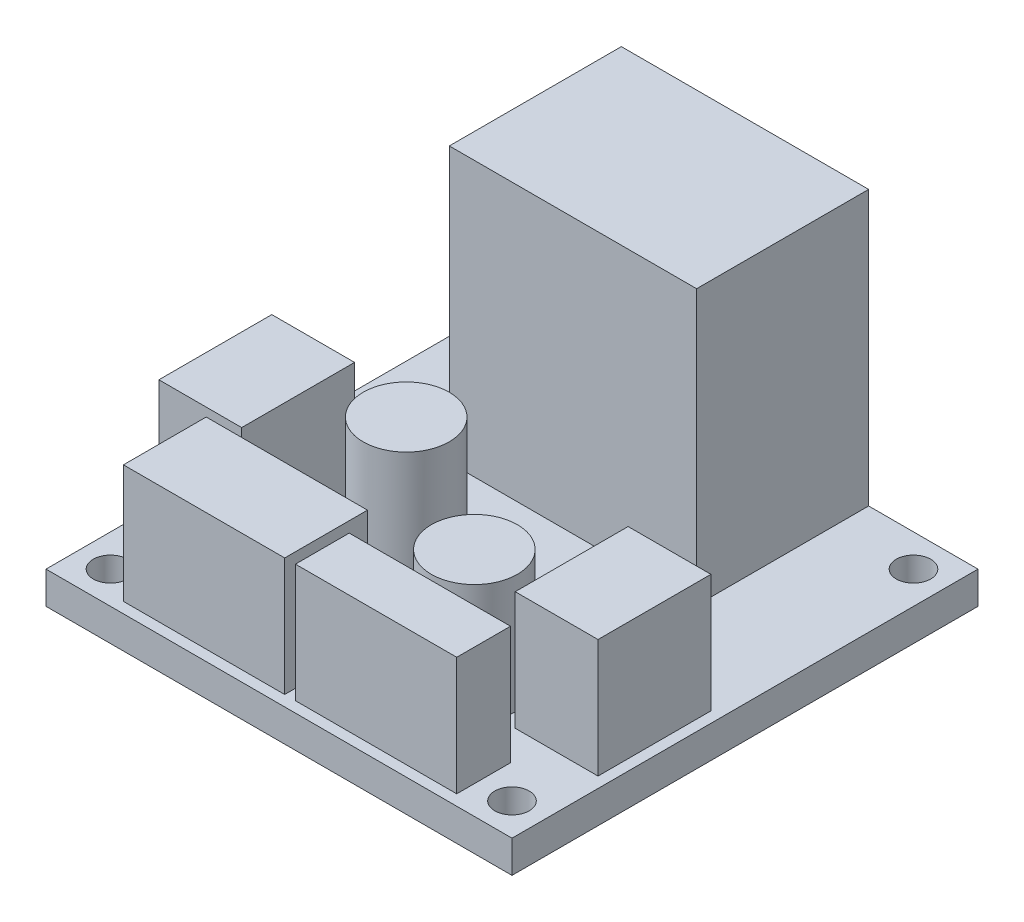
ISO-10303-21;
HEADER;
FILE_DESCRIPTION(('STEP AP214'),'2;1');
FILE_NAME('part.step','',(''),(''),'','','');
FILE_SCHEMA(('AUTOMOTIVE_DESIGN { 1 0 10303 214 1 1 1 1 }'));
ENDSEC;
DATA;
#1=APPLICATION_CONTEXT('core data for automotive mechanical design processes');
#2=APPLICATION_PROTOCOL_DEFINITION('international standard','automotive_design',2000,#1);
#3=PRODUCT_CONTEXT('',#1,'mechanical');
#4=PRODUCT('Part','Part','',(#3));
#5=PRODUCT_RELATED_PRODUCT_CATEGORY('part','',(#4));
#6=PRODUCT_DEFINITION_FORMATION('','',#4);
#7=PRODUCT_DEFINITION_CONTEXT('part definition',#1,'design');
#8=PRODUCT_DEFINITION('design','',#6,#7);
#9=PRODUCT_DEFINITION_SHAPE('','',#8);
#10=(LENGTH_UNIT() NAMED_UNIT(*) SI_UNIT(.MILLI.,.METRE.));
#11=(NAMED_UNIT(*) PLANE_ANGLE_UNIT() SI_UNIT($,.RADIAN.));
#12=(NAMED_UNIT(*) SI_UNIT($,.STERADIAN.) SOLID_ANGLE_UNIT());
#13=UNCERTAINTY_MEASURE_WITH_UNIT(LENGTH_MEASURE(1.E-05),#10,'distance_accuracy_value','');
#14=(GEOMETRIC_REPRESENTATION_CONTEXT(3) GLOBAL_UNCERTAINTY_ASSIGNED_CONTEXT((#13)) GLOBAL_UNIT_ASSIGNED_CONTEXT((#10,
#11,#12)) REPRESENTATION_CONTEXT('',''));
#15=CARTESIAN_POINT('',(0.,0.,0.));
#16=DIRECTION('',(0.,0.,1.));
#17=DIRECTION('',(1.,0.,0.));
#18=AXIS2_PLACEMENT_3D('',#15,#16,#17);
#19=CARTESIAN_POINT('',(0.,3.,0.));
#20=DIRECTION('',(0.,-1.,0.));
#21=DIRECTION('',(0.,0.,-1.));
#22=AXIS2_PLACEMENT_3D('',#19,#20,#21);
#23=PLANE('',#22);
#24=CARTESIAN_POINT('',(-18.67,3.,18.67));
#25=DIRECTION('',(0.,1.,0.));
#26=DIRECTION('',(0.,0.,1.));
#27=AXIS2_PLACEMENT_3D('',#24,#25,#26);
#28=CIRCLE('',#27,1.6);
#29=CARTESIAN_POINT('',(-18.67,3.,20.27));
#30=VERTEX_POINT('',#29);
#31=EDGE_CURVE('E422',#30,#30,#28,.T.);
#32=ORIENTED_EDGE('',*,*,#31,.F.);
#33=EDGE_LOOP('',(#32));
#34=FACE_BOUND('',#33,.T.);
#35=CARTESIAN_POINT('',(18.67,3.,18.67));
#36=DIRECTION('',(0.,1.,0.));
#37=DIRECTION('',(0.,0.,1.));
#38=AXIS2_PLACEMENT_3D('',#35,#36,#37);
#39=CIRCLE('',#38,1.6);
#40=CARTESIAN_POINT('',(18.67,3.,20.27));
#41=VERTEX_POINT('',#40);
#42=EDGE_CURVE('E428',#41,#41,#39,.T.);
#43=ORIENTED_EDGE('',*,*,#42,.F.);
#44=EDGE_LOOP('',(#43));
#45=FACE_BOUND('',#44,.T.);
#46=CARTESIAN_POINT('',(18.67,3.,-18.67));
#47=DIRECTION('',(0.,1.,0.));
#48=DIRECTION('',(0.,0.,1.));
#49=AXIS2_PLACEMENT_3D('',#46,#47,#48);
#50=CIRCLE('',#49,1.6);
#51=CARTESIAN_POINT('',(18.67,3.,-17.07));
#52=VERTEX_POINT('',#51);
#53=EDGE_CURVE('E434',#52,#52,#50,.T.);
#54=ORIENTED_EDGE('',*,*,#53,.F.);
#55=EDGE_LOOP('',(#54));
#56=FACE_BOUND('',#55,.T.);
#57=CARTESIAN_POINT('',(-18.67,3.,-18.67));
#58=DIRECTION('',(0.,1.,0.));
#59=DIRECTION('',(0.,0.,1.));
#60=AXIS2_PLACEMENT_3D('',#57,#58,#59);
#61=CIRCLE('',#60,1.6);
#62=CARTESIAN_POINT('',(-18.67,3.,-17.07));
#63=VERTEX_POINT('',#62);
#64=EDGE_CURVE('E416',#63,#63,#61,.T.);
#65=ORIENTED_EDGE('',*,*,#64,.F.);
#66=EDGE_LOOP('',(#65));
#67=FACE_BOUND('',#66,.T.);
#68=CARTESIAN_POINT('',(7.67,3.,11.17));
#69=DIRECTION('',(0.,-1.,0.));
#70=DIRECTION('',(0.,0.,-1.));
#71=AXIS2_PLACEMENT_3D('',#68,#69,#70);
#72=CIRCLE('',#71,4.);
#73=CARTESIAN_POINT('',(7.67,3.,7.17));
#74=VERTEX_POINT('',#73);
#75=EDGE_CURVE('E12',#74,#74,#72,.F.);
#76=ORIENTED_EDGE('',*,*,#75,.F.);
#77=EDGE_LOOP('',(#76));
#78=FACE_BOUND('',#77,.T.);
#79=CARTESIAN_POINT('',(-6.17,3.,3.67));
#80=DIRECTION('',(0.,-1.,0.));
#81=DIRECTION('',(0.,0.,-1.));
#82=AXIS2_PLACEMENT_3D('',#79,#80,#81);
#83=CIRCLE('',#82,4.);
#84=CARTESIAN_POINT('',(-6.17,3.,-0.329999999999998));
#85=VERTEX_POINT('',#84);
#86=EDGE_CURVE('E44',#85,#85,#83,.F.);
#87=ORIENTED_EDGE('',*,*,#86,.F.);
#88=EDGE_LOOP('',(#87));
#89=FACE_BOUND('',#88,.T.);
#90=DIRECTION('',(0.,0.,1.));
#91=VECTOR('',#90,1.);
#92=CARTESIAN_POINT('',(0.529999999999997,3.,15.67));
#93=LINE('',#92,#91);
#94=CARTESIAN_POINT('',(0.529999999999997,3.,15.67));
#95=VERTEX_POINT('',#94);
#96=CARTESIAN_POINT('',(0.529999999999998,3.,20.67));
#97=VERTEX_POINT('',#96);
#98=EDGE_CURVE('E218',#95,#97,#93,.T.);
#99=ORIENTED_EDGE('',*,*,#98,.F.);
#100=DIRECTION('',(-1.,0.,0.));
#101=VECTOR('',#100,1.);
#102=CARTESIAN_POINT('',(0.529999999999997,3.,15.67));
#103=LINE('',#102,#101);
#104=CARTESIAN_POINT('',(15.53,3.,15.67));
#105=VERTEX_POINT('',#104);
#106=EDGE_CURVE('E231',#105,#95,#103,.T.);
#107=ORIENTED_EDGE('',*,*,#106,.F.);
#108=DIRECTION('',(0.,0.,-1.));
#109=VECTOR('',#108,1.);
#110=CARTESIAN_POINT('',(15.53,3.,15.67));
#111=LINE('',#110,#109);
#112=CARTESIAN_POINT('',(15.53,3.,20.67));
#113=VERTEX_POINT('',#112);
#114=EDGE_CURVE('E240',#113,#105,#111,.T.);
#115=ORIENTED_EDGE('',*,*,#114,.F.);
#116=DIRECTION('',(1.,0.,0.));
#117=VECTOR('',#116,1.);
#118=CARTESIAN_POINT('',(0.529999999999998,3.,20.67));
#119=LINE('',#118,#117);
#120=EDGE_CURVE('E221',#97,#113,#119,.T.);
#121=ORIENTED_EDGE('',*,*,#120,.F.);
#122=EDGE_LOOP('',(#99,#107,#115,#121));
#123=FACE_BOUND('',#122,.T.);
#124=DIRECTION('',(0.,0.,1.));
#125=VECTOR('',#124,1.);
#126=CARTESIAN_POINT('',(-20.67,3.,1.67));
#127=LINE('',#126,#125);
#128=CARTESIAN_POINT('',(-20.67,3.,1.67));
#129=VERTEX_POINT('',#128);
#130=CARTESIAN_POINT('',(-20.67,3.,12.17));
#131=VERTEX_POINT('',#130);
#132=EDGE_CURVE('E289',#129,#131,#127,.T.);
#133=ORIENTED_EDGE('',*,*,#132,.F.);
#134=DIRECTION('',(-1.,0.,0.));
#135=VECTOR('',#134,1.);
#136=CARTESIAN_POINT('',(-20.67,3.,1.67));
#137=LINE('',#136,#135);
#138=CARTESIAN_POINT('',(-12.97,3.,1.67));
#139=VERTEX_POINT('',#138);
#140=EDGE_CURVE('E294',#139,#129,#137,.T.);
#141=ORIENTED_EDGE('',*,*,#140,.F.);
#142=DIRECTION('',(0.,0.,-1.));
#143=VECTOR('',#142,1.);
#144=CARTESIAN_POINT('',(-12.97,3.,1.67));
#145=LINE('',#144,#143);
#146=CARTESIAN_POINT('',(-12.97,3.,12.17));
#147=VERTEX_POINT('',#146);
#148=EDGE_CURVE('E306',#147,#139,#145,.T.);
#149=ORIENTED_EDGE('',*,*,#148,.F.);
#150=DIRECTION('',(1.,0.,0.));
#151=VECTOR('',#150,1.);
#152=CARTESIAN_POINT('',(-20.67,3.,12.17));
#153=LINE('',#152,#151);
#154=EDGE_CURVE('E303',#131,#147,#153,.T.);
#155=ORIENTED_EDGE('',*,*,#154,.F.);
#156=EDGE_LOOP('',(#133,#141,#149,#155));
#157=FACE_BOUND('',#156,.T.);
#158=DIRECTION('',(1.,0.,0.));
#159=VECTOR('',#158,1.);
#160=CARTESIAN_POINT('',(-21.67,3.,21.67));
#161=LINE('',#160,#159);
#162=CARTESIAN_POINT('',(-21.67,3.,21.67));
#163=VERTEX_POINT('',#162);
#164=CARTESIAN_POINT('',(21.67,3.,21.67));
#165=VERTEX_POINT('',#164);
#166=EDGE_CURVE('E332',#163,#165,#161,.T.);
#167=ORIENTED_EDGE('',*,*,#166,.T.);
#168=DIRECTION('',(0.,0.,-1.));
#169=VECTOR('',#168,1.);
#170=CARTESIAN_POINT('',(21.67,3.,21.67));
#171=LINE('',#170,#169);
#172=CARTESIAN_POINT('',(21.67,3.,-21.67));
#173=VERTEX_POINT('',#172);
#174=EDGE_CURVE('E325',#165,#173,#171,.T.);
#175=ORIENTED_EDGE('',*,*,#174,.T.);
#176=DIRECTION('',(-1.,0.,0.));
#177=VECTOR('',#176,1.);
#178=CARTESIAN_POINT('',(21.67,3.,-21.67));
#179=LINE('',#178,#177);
#180=CARTESIAN_POINT('',(11.5,3.,-21.67));
#181=VERTEX_POINT('',#180);
#182=EDGE_CURVE('E331',#173,#181,#179,.T.);
#183=ORIENTED_EDGE('',*,*,#182,.T.);
#184=DIRECTION('',(0.,0.,1.));
#185=VECTOR('',#184,1.);
#186=CARTESIAN_POINT('',(11.5,3.,-21.67));
#187=LINE('',#186,#185);
#188=CARTESIAN_POINT('',(11.5,3.,-5.67));
#189=VERTEX_POINT('',#188);
#190=EDGE_CURVE('E348',#181,#189,#187,.T.);
#191=ORIENTED_EDGE('',*,*,#190,.T.);
#192=DIRECTION('',(-1.,0.,0.));
#193=VECTOR('',#192,1.);
#194=CARTESIAN_POINT('',(-11.5,3.,-5.67));
#195=LINE('',#194,#193);
#196=CARTESIAN_POINT('',(-11.5,3.,-5.67));
#197=VERTEX_POINT('',#196);
#198=EDGE_CURVE('E344',#189,#197,#195,.T.);
#199=ORIENTED_EDGE('',*,*,#198,.T.);
#200=DIRECTION('',(0.,0.,-1.));
#201=VECTOR('',#200,1.);
#202=CARTESIAN_POINT('',(-11.5,3.,-21.67));
#203=LINE('',#202,#201);
#204=CARTESIAN_POINT('',(-11.5,3.,-21.67));
#205=VERTEX_POINT('',#204);
#206=EDGE_CURVE('E340',#197,#205,#203,.T.);
#207=ORIENTED_EDGE('',*,*,#206,.T.);
#208=DIRECTION('',(-1.,0.,0.));
#209=VECTOR('',#208,1.);
#210=CARTESIAN_POINT('',(-11.5,3.,-21.67));
#211=LINE('',#210,#209);
#212=CARTESIAN_POINT('',(-21.67,3.,-21.67));
#213=VERTEX_POINT('',#212);
#214=EDGE_CURVE('E337',#205,#213,#211,.T.);
#215=ORIENTED_EDGE('',*,*,#214,.T.);
#216=DIRECTION('',(0.,0.,1.));
#217=VECTOR('',#216,1.);
#218=CARTESIAN_POINT('',(-21.67,3.,-21.67));
#219=LINE('',#218,#217);
#220=EDGE_CURVE('E335',#213,#163,#219,.T.);
#221=ORIENTED_EDGE('',*,*,#220,.T.);
#222=EDGE_LOOP('',(#167,#175,#183,#191,#199,#207,#215,#221));
#223=FACE_BOUND('',#222,.T.);
#224=DIRECTION('',(0.,0.,1.));
#225=VECTOR('',#224,1.);
#226=CARTESIAN_POINT('',(-15.47,3.,12.97));
#227=LINE('',#226,#225);
#228=CARTESIAN_POINT('',(-15.47,3.,12.97));
#229=VERTEX_POINT('',#228);
#230=CARTESIAN_POINT('',(-15.47,3.,20.67));
#231=VERTEX_POINT('',#230);
#232=EDGE_CURVE('E256',#229,#231,#227,.T.);
#233=ORIENTED_EDGE('',*,*,#232,.F.);
#234=DIRECTION('',(-1.,0.,0.));
#235=VECTOR('',#234,1.);
#236=CARTESIAN_POINT('',(-15.47,3.,12.97));
#237=LINE('',#236,#235);
#238=CARTESIAN_POINT('',(-0.470000000000003,3.,12.97));
#239=VERTEX_POINT('',#238);
#240=EDGE_CURVE('E261',#239,#229,#237,.T.);
#241=ORIENTED_EDGE('',*,*,#240,.F.);
#242=DIRECTION('',(0.,0.,-1.));
#243=VECTOR('',#242,1.);
#244=CARTESIAN_POINT('',(-0.470000000000003,3.,12.97));
#245=LINE('',#244,#243);
#246=CARTESIAN_POINT('',(-0.470000000000003,3.,20.67));
#247=VERTEX_POINT('',#246);
#248=EDGE_CURVE('E273',#247,#239,#245,.T.);
#249=ORIENTED_EDGE('',*,*,#248,.F.);
#250=DIRECTION('',(1.,0.,0.));
#251=VECTOR('',#250,1.);
#252=CARTESIAN_POINT('',(-15.47,3.,20.67));
#253=LINE('',#252,#251);
#254=EDGE_CURVE('E270',#231,#247,#253,.T.);
#255=ORIENTED_EDGE('',*,*,#254,.F.);
#256=EDGE_LOOP('',(#233,#241,#249,#255));
#257=FACE_BOUND('',#256,.T.);
#258=DIRECTION('',(0.,0.,1.));
#259=VECTOR('',#258,1.);
#260=CARTESIAN_POINT('',(12.97,3.,2.17));
#261=LINE('',#260,#259);
#262=CARTESIAN_POINT('',(12.97,3.,2.17));
#263=VERTEX_POINT('',#262);
#264=CARTESIAN_POINT('',(12.97,3.,12.67));
#265=VERTEX_POINT('',#264);
#266=EDGE_CURVE('E217',#263,#265,#261,.T.);
#267=ORIENTED_EDGE('',*,*,#266,.F.);
#268=DIRECTION('',(-1.,0.,0.));
#269=VECTOR('',#268,1.);
#270=CARTESIAN_POINT('',(12.97,3.,2.17));
#271=LINE('',#270,#269);
#272=CARTESIAN_POINT('',(20.67,3.,2.17));
#273=VERTEX_POINT('',#272);
#274=EDGE_CURVE('E214',#273,#263,#271,.T.);
#275=ORIENTED_EDGE('',*,*,#274,.F.);
#276=DIRECTION('',(0.,0.,-1.));
#277=VECTOR('',#276,1.);
#278=CARTESIAN_POINT('',(20.67,3.,2.17));
#279=LINE('',#278,#277);
#280=CARTESIAN_POINT('',(20.67,3.,12.67));
#281=VERTEX_POINT('',#280);
#282=EDGE_CURVE('E56',#281,#273,#279,.T.);
#283=ORIENTED_EDGE('',*,*,#282,.F.);
#284=DIRECTION('',(1.,0.,0.));
#285=VECTOR('',#284,1.);
#286=CARTESIAN_POINT('',(12.97,3.,12.67));
#287=LINE('',#286,#285);
#288=EDGE_CURVE('E51',#265,#281,#287,.T.);
#289=ORIENTED_EDGE('',*,*,#288,.F.);
#290=EDGE_LOOP('',(#267,#275,#283,#289));
#291=FACE_BOUND('',#290,.T.);
#292=ADVANCED_FACE('F36',(#34,#45,#56,#67,#78,#89,#123,#157,#223,#257,#291),#23,.F.);
#293=CARTESIAN_POINT('',(21.67,28.5,21.67));
#294=DIRECTION('',(-1.,0.,0.));
#295=DIRECTION('',(0.,0.,1.));
#296=AXIS2_PLACEMENT_3D('',#293,#294,#295);
#297=PLANE('',#296);
#298=DIRECTION('',(0.,-1.,0.));
#299=VECTOR('',#298,1.);
#300=CARTESIAN_POINT('',(21.67,28.5,-21.67));
#301=LINE('',#300,#299);
#302=CARTESIAN_POINT('',(21.67,0.,-21.67));
#303=VERTEX_POINT('',#302);
#304=EDGE_CURVE('E380',#173,#303,#301,.T.);
#305=ORIENTED_EDGE('',*,*,#304,.F.);
#306=ORIENTED_EDGE('',*,*,#174,.F.);
#307=DIRECTION('',(0.,-1.,0.));
#308=VECTOR('',#307,1.);
#309=CARTESIAN_POINT('',(21.67,28.5,21.67));
#310=LINE('',#309,#308);
#311=CARTESIAN_POINT('',(21.67,0.,21.67));
#312=VERTEX_POINT('',#311);
#313=EDGE_CURVE('E363',#165,#312,#310,.T.);
#314=ORIENTED_EDGE('',*,*,#313,.T.);
#315=DIRECTION('',(0.,0.,-1.));
#316=VECTOR('',#315,1.);
#317=CARTESIAN_POINT('',(21.67,0.,21.67));
#318=LINE('',#317,#316);
#319=EDGE_CURVE('E334',#312,#303,#318,.T.);
#320=ORIENTED_EDGE('',*,*,#319,.T.);
#321=EDGE_LOOP('',(#305,#306,#314,#320));
#322=FACE_BOUND('',#321,.T.);
#323=ADVANCED_FACE('F38',(#322),#297,.F.);
#324=CARTESIAN_POINT('',(-21.67,28.5,-21.67));
#325=DIRECTION('',(0.,0.,1.));
#326=DIRECTION('',(1.,0.,0.));
#327=AXIS2_PLACEMENT_3D('',#324,#325,#326);
#328=PLANE('',#327);
#329=DIRECTION('',(0.,1.,0.));
#330=VECTOR('',#329,1.);
#331=CARTESIAN_POINT('',(11.5,-61.2920157932499,-21.67));
#332=LINE('',#331,#330);
#333=CARTESIAN_POINT('',(11.5,28.5,-21.67));
#334=VERTEX_POINT('',#333);
#335=EDGE_CURVE('E351',#181,#334,#332,.T.);
#336=ORIENTED_EDGE('',*,*,#335,.F.);
#337=ORIENTED_EDGE('',*,*,#182,.F.);
#338=ORIENTED_EDGE('',*,*,#304,.T.);
#339=DIRECTION('',(-1.,0.,0.));
#340=VECTOR('',#339,1.);
#341=CARTESIAN_POINT('',(-21.67,0.,-21.67));
#342=LINE('',#341,#340);
#343=CARTESIAN_POINT('',(-21.67,0.,-21.67));
#344=VERTEX_POINT('',#343);
#345=EDGE_CURVE('E367',#303,#344,#342,.T.);
#346=ORIENTED_EDGE('',*,*,#345,.T.);
#347=DIRECTION('',(0.,-1.,0.));
#348=VECTOR('',#347,1.);
#349=CARTESIAN_POINT('',(-21.67,28.5,-21.67));
#350=LINE('',#349,#348);
#351=EDGE_CURVE('E378',#213,#344,#350,.T.);
#352=ORIENTED_EDGE('',*,*,#351,.F.);
#353=ORIENTED_EDGE('',*,*,#214,.F.);
#354=DIRECTION('',(0.,1.,0.));
#355=VECTOR('',#354,1.);
#356=CARTESIAN_POINT('',(-11.5,-61.2920157932499,-21.67));
#357=LINE('',#356,#355);
#358=CARTESIAN_POINT('',(-11.5,28.5,-21.67));
#359=VERTEX_POINT('',#358);
#360=EDGE_CURVE('E339',#205,#359,#357,.T.);
#361=ORIENTED_EDGE('',*,*,#360,.T.);
#362=DIRECTION('',(-1.,0.,0.));
#363=VECTOR('',#362,1.);
#364=CARTESIAN_POINT('',(-21.67,28.5,-21.67));
#365=LINE('',#364,#363);
#366=EDGE_CURVE('E360',#334,#359,#365,.T.);
#367=ORIENTED_EDGE('',*,*,#366,.F.);
#368=EDGE_LOOP('',(#336,#337,#338,#346,#352,#353,#361,#367));
#369=FACE_BOUND('',#368,.T.);
#370=ADVANCED_FACE('F573',(#369),#328,.F.);
#371=CARTESIAN_POINT('',(-21.67,28.5,21.67));
#372=DIRECTION('',(1.,0.,0.));
#373=DIRECTION('',(0.,0.,-1.));
#374=AXIS2_PLACEMENT_3D('',#371,#372,#373);
#375=PLANE('',#374);
#376=DIRECTION('',(0.,-1.,0.));
#377=VECTOR('',#376,1.);
#378=CARTESIAN_POINT('',(-21.67,28.5,21.67));
#379=LINE('',#378,#377);
#380=CARTESIAN_POINT('',(-21.67,0.,21.67));
#381=VERTEX_POINT('',#380);
#382=EDGE_CURVE('E376',#163,#381,#379,.T.);
#383=ORIENTED_EDGE('',*,*,#382,.F.);
#384=ORIENTED_EDGE('',*,*,#220,.F.);
#385=ORIENTED_EDGE('',*,*,#351,.T.);
#386=DIRECTION('',(0.,0.,1.));
#387=VECTOR('',#386,1.);
#388=CARTESIAN_POINT('',(-21.67,0.,21.67));
#389=LINE('',#388,#387);
#390=EDGE_CURVE('E370',#344,#381,#389,.T.);
#391=ORIENTED_EDGE('',*,*,#390,.T.);
#392=EDGE_LOOP('',(#383,#384,#385,#391));
#393=FACE_BOUND('',#392,.T.);
#394=ADVANCED_FACE('F570',(#393),#375,.F.);
#395=CARTESIAN_POINT('',(-21.67,28.5,21.67));
#396=DIRECTION('',(0.,0.,-1.));
#397=DIRECTION('',(-1.,0.,0.));
#398=AXIS2_PLACEMENT_3D('',#395,#396,#397);
#399=PLANE('',#398);
#400=ORIENTED_EDGE('',*,*,#313,.F.);
#401=ORIENTED_EDGE('',*,*,#166,.F.);
#402=ORIENTED_EDGE('',*,*,#382,.T.);
#403=DIRECTION('',(1.,0.,0.));
#404=VECTOR('',#403,1.);
#405=CARTESIAN_POINT('',(-21.67,0.,21.67));
#406=LINE('',#405,#404);
#407=EDGE_CURVE('E364',#381,#312,#406,.T.);
#408=ORIENTED_EDGE('',*,*,#407,.T.);
#409=EDGE_LOOP('',(#400,#401,#402,#408));
#410=FACE_BOUND('',#409,.T.);
#411=ADVANCED_FACE('F563',(#410),#399,.F.);
#412=CARTESIAN_POINT('',(0.,28.5,0.));
#413=DIRECTION('',(0.,-1.,0.));
#414=DIRECTION('',(0.,0.,-1.));
#415=AXIS2_PLACEMENT_3D('',#412,#413,#414);
#416=PLANE('',#415);
#417=DIRECTION('',(-1.,0.,0.));
#418=VECTOR('',#417,1.);
#419=CARTESIAN_POINT('',(-11.5,28.5,-5.67));
#420=LINE('',#419,#418);
#421=CARTESIAN_POINT('',(11.5,28.5,-5.67));
#422=VERTEX_POINT('',#421);
#423=CARTESIAN_POINT('',(-11.5,28.5,-5.67));
#424=VERTEX_POINT('',#423);
#425=EDGE_CURVE('E326',#422,#424,#420,.T.);
#426=ORIENTED_EDGE('',*,*,#425,.F.);
#427=DIRECTION('',(0.,0.,1.));
#428=VECTOR('',#427,1.);
#429=CARTESIAN_POINT('',(11.5,28.5,-21.67));
#430=LINE('',#429,#428);
#431=EDGE_CURVE('E322',#334,#422,#430,.T.);
#432=ORIENTED_EDGE('',*,*,#431,.F.);
#433=ORIENTED_EDGE('',*,*,#366,.T.);
#434=DIRECTION('',(0.,0.,-1.));
#435=VECTOR('',#434,1.);
#436=CARTESIAN_POINT('',(-11.5,28.5,-21.67));
#437=LINE('',#436,#435);
#438=EDGE_CURVE('E323',#424,#359,#437,.T.);
#439=ORIENTED_EDGE('',*,*,#438,.F.);
#440=EDGE_LOOP('',(#426,#432,#433,#439));
#441=FACE_BOUND('',#440,.T.);
#442=ADVANCED_FACE('F560',(#441),#416,.F.);
#443=CARTESIAN_POINT('',(0.,0.,0.));
#444=DIRECTION('',(0.,-1.,0.));
#445=DIRECTION('',(0.,0.,-1.));
#446=AXIS2_PLACEMENT_3D('',#443,#444,#445);
#447=PLANE('',#446);
#448=CARTESIAN_POINT('',(-18.67,0.,18.67));
#449=DIRECTION('',(0.,1.,0.));
#450=DIRECTION('',(0.,0.,1.));
#451=AXIS2_PLACEMENT_3D('',#448,#449,#450);
#452=CIRCLE('',#451,1.6);
#453=CARTESIAN_POINT('',(-18.67,0.,20.27));
#454=VERTEX_POINT('',#453);
#455=EDGE_CURVE('E425',#454,#454,#452,.T.);
#456=ORIENTED_EDGE('',*,*,#455,.T.);
#457=EDGE_LOOP('',(#456));
#458=FACE_BOUND('',#457,.T.);
#459=CARTESIAN_POINT('',(18.67,0.,18.67));
#460=DIRECTION('',(0.,1.,0.));
#461=DIRECTION('',(0.,0.,1.));
#462=AXIS2_PLACEMENT_3D('',#459,#460,#461);
#463=CIRCLE('',#462,1.6);
#464=CARTESIAN_POINT('',(18.67,0.,20.27));
#465=VERTEX_POINT('',#464);
#466=EDGE_CURVE('E431',#465,#465,#463,.T.);
#467=ORIENTED_EDGE('',*,*,#466,.T.);
#468=EDGE_LOOP('',(#467));
#469=FACE_BOUND('',#468,.T.);
#470=CARTESIAN_POINT('',(18.67,0.,-18.67));
#471=DIRECTION('',(0.,1.,0.));
#472=DIRECTION('',(0.,0.,1.));
#473=AXIS2_PLACEMENT_3D('',#470,#471,#472);
#474=CIRCLE('',#473,1.6);
#475=CARTESIAN_POINT('',(18.67,0.,-17.07));
#476=VERTEX_POINT('',#475);
#477=EDGE_CURVE('E419',#476,#476,#474,.T.);
#478=ORIENTED_EDGE('',*,*,#477,.T.);
#479=EDGE_LOOP('',(#478));
#480=FACE_BOUND('',#479,.T.);
#481=CARTESIAN_POINT('',(-18.67,0.,-18.67));
#482=DIRECTION('',(0.,1.,0.));
#483=DIRECTION('',(0.,0.,1.));
#484=AXIS2_PLACEMENT_3D('',#481,#482,#483);
#485=CIRCLE('',#484,1.6);
#486=CARTESIAN_POINT('',(-18.67,0.,-17.07));
#487=VERTEX_POINT('',#486);
#488=EDGE_CURVE('E415',#487,#487,#485,.T.);
#489=ORIENTED_EDGE('',*,*,#488,.T.);
#490=EDGE_LOOP('',(#489));
#491=FACE_BOUND('',#490,.T.);
#492=ORIENTED_EDGE('',*,*,#319,.F.);
#493=ORIENTED_EDGE('',*,*,#407,.F.);
#494=ORIENTED_EDGE('',*,*,#390,.F.);
#495=ORIENTED_EDGE('',*,*,#345,.F.);
#496=EDGE_LOOP('',(#492,#493,#494,#495));
#497=FACE_BOUND('',#496,.T.);
#498=ADVANCED_FACE('F440',(#458,#469,#480,#491,#497),#447,.T.);
#499=CARTESIAN_POINT('',(11.5,-61.2920157932499,-21.67));
#500=DIRECTION('',(-1.,0.,0.));
#501=DIRECTION('',(0.,0.,1.));
#502=AXIS2_PLACEMENT_3D('',#499,#500,#501);
#503=PLANE('',#502);
#504=ORIENTED_EDGE('',*,*,#335,.T.);
#505=ORIENTED_EDGE('',*,*,#431,.T.);
#506=DIRECTION('',(0.,1.,0.));
#507=VECTOR('',#506,1.);
#508=CARTESIAN_POINT('',(11.5,-61.2920157932499,-5.67));
#509=LINE('',#508,#507);
#510=EDGE_CURVE('E347',#189,#422,#509,.T.);
#511=ORIENTED_EDGE('',*,*,#510,.F.);
#512=ORIENTED_EDGE('',*,*,#190,.F.);
#513=EDGE_LOOP('',(#504,#505,#511,#512));
#514=FACE_BOUND('',#513,.T.);
#515=ADVANCED_FACE('F555',(#514),#503,.F.);
#516=CARTESIAN_POINT('',(-11.5,-61.2920157932499,-5.67));
#517=DIRECTION('',(0.,0.,-1.));
#518=DIRECTION('',(-1.,0.,0.));
#519=AXIS2_PLACEMENT_3D('',#516,#517,#518);
#520=PLANE('',#519);
#521=ORIENTED_EDGE('',*,*,#510,.T.);
#522=ORIENTED_EDGE('',*,*,#425,.T.);
#523=DIRECTION('',(0.,1.,0.));
#524=VECTOR('',#523,1.);
#525=CARTESIAN_POINT('',(-11.5,-61.2920157932499,-5.67));
#526=LINE('',#525,#524);
#527=EDGE_CURVE('E343',#197,#424,#526,.T.);
#528=ORIENTED_EDGE('',*,*,#527,.F.);
#529=ORIENTED_EDGE('',*,*,#198,.F.);
#530=EDGE_LOOP('',(#521,#522,#528,#529));
#531=FACE_BOUND('',#530,.T.);
#532=ADVANCED_FACE('F551',(#531),#520,.F.);
#533=CARTESIAN_POINT('',(-11.5,-61.2920157932499,-21.67));
#534=DIRECTION('',(1.,0.,0.));
#535=DIRECTION('',(0.,0.,-1.));
#536=AXIS2_PLACEMENT_3D('',#533,#534,#535);
#537=PLANE('',#536);
#538=ORIENTED_EDGE('',*,*,#527,.T.);
#539=ORIENTED_EDGE('',*,*,#438,.T.);
#540=ORIENTED_EDGE('',*,*,#360,.F.);
#541=ORIENTED_EDGE('',*,*,#206,.F.);
#542=EDGE_LOOP('',(#538,#539,#540,#541));
#543=FACE_BOUND('',#542,.T.);
#544=ADVANCED_FACE('F547',(#543),#537,.F.);
#545=CARTESIAN_POINT('',(-20.67,14.,1.67));
#546=DIRECTION('',(1.,0.,0.));
#547=DIRECTION('',(0.,0.,-1.));
#548=AXIS2_PLACEMENT_3D('',#545,#546,#547);
#549=PLANE('',#548);
#550=ORIENTED_EDGE('',*,*,#132,.T.);
#551=DIRECTION('',(0.,-1.,0.));
#552=VECTOR('',#551,1.);
#553=CARTESIAN_POINT('',(-20.67,14.,12.17));
#554=LINE('',#553,#552);
#555=CARTESIAN_POINT('',(-20.67,14.,12.17));
#556=VERTEX_POINT('',#555);
#557=EDGE_CURVE('E319',#556,#131,#554,.T.);
#558=ORIENTED_EDGE('',*,*,#557,.F.);
#559=DIRECTION('',(0.,0.,1.));
#560=VECTOR('',#559,1.);
#561=CARTESIAN_POINT('',(-20.67,14.,1.67));
#562=LINE('',#561,#560);
#563=CARTESIAN_POINT('',(-20.67,14.,1.67));
#564=VERTEX_POINT('',#563);
#565=EDGE_CURVE('E290',#564,#556,#562,.T.);
#566=ORIENTED_EDGE('',*,*,#565,.F.);
#567=DIRECTION('',(0.,-1.,0.));
#568=VECTOR('',#567,1.);
#569=CARTESIAN_POINT('',(-20.67,14.,1.67));
#570=LINE('',#569,#568);
#571=EDGE_CURVE('E300',#564,#129,#570,.T.);
#572=ORIENTED_EDGE('',*,*,#571,.T.);
#573=EDGE_LOOP('',(#550,#558,#566,#572));
#574=FACE_BOUND('',#573,.T.);
#575=ADVANCED_FACE('F543',(#574),#549,.F.);
#576=CARTESIAN_POINT('',(-20.67,14.,12.17));
#577=DIRECTION('',(0.,0.,-1.));
#578=DIRECTION('',(-1.,0.,0.));
#579=AXIS2_PLACEMENT_3D('',#576,#577,#578);
#580=PLANE('',#579);
#581=ORIENTED_EDGE('',*,*,#154,.T.);
#582=DIRECTION('',(0.,-1.,0.));
#583=VECTOR('',#582,1.);
#584=CARTESIAN_POINT('',(-12.97,14.,12.17));
#585=LINE('',#584,#583);
#586=CARTESIAN_POINT('',(-12.97,14.,12.17));
#587=VERTEX_POINT('',#586);
#588=EDGE_CURVE('E316',#587,#147,#585,.T.);
#589=ORIENTED_EDGE('',*,*,#588,.F.);
#590=DIRECTION('',(1.,0.,0.));
#591=VECTOR('',#590,1.);
#592=CARTESIAN_POINT('',(-20.67,14.,12.17));
#593=LINE('',#592,#591);
#594=EDGE_CURVE('E293',#556,#587,#593,.T.);
#595=ORIENTED_EDGE('',*,*,#594,.F.);
#596=ORIENTED_EDGE('',*,*,#557,.T.);
#597=EDGE_LOOP('',(#581,#589,#595,#596));
#598=FACE_BOUND('',#597,.T.);
#599=ADVANCED_FACE('F539',(#598),#580,.F.);
#600=CARTESIAN_POINT('',(-12.97,14.,1.67));
#601=DIRECTION('',(-1.,0.,0.));
#602=DIRECTION('',(0.,0.,1.));
#603=AXIS2_PLACEMENT_3D('',#600,#601,#602);
#604=PLANE('',#603);
#605=ORIENTED_EDGE('',*,*,#148,.T.);
#606=DIRECTION('',(0.,-1.,0.));
#607=VECTOR('',#606,1.);
#608=CARTESIAN_POINT('',(-12.97,14.,1.67));
#609=LINE('',#608,#607);
#610=CARTESIAN_POINT('',(-12.97,14.,1.67));
#611=VERTEX_POINT('',#610);
#612=EDGE_CURVE('E313',#611,#139,#609,.T.);
#613=ORIENTED_EDGE('',*,*,#612,.F.);
#614=DIRECTION('',(0.,0.,-1.));
#615=VECTOR('',#614,1.);
#616=CARTESIAN_POINT('',(-12.97,14.,1.67));
#617=LINE('',#616,#615);
#618=EDGE_CURVE('E296',#587,#611,#617,.T.);
#619=ORIENTED_EDGE('',*,*,#618,.F.);
#620=ORIENTED_EDGE('',*,*,#588,.T.);
#621=EDGE_LOOP('',(#605,#613,#619,#620));
#622=FACE_BOUND('',#621,.T.);
#623=ADVANCED_FACE('F535',(#622),#604,.F.);
#624=CARTESIAN_POINT('',(-20.67,14.,1.67));
#625=DIRECTION('',(0.,0.,1.));
#626=DIRECTION('',(1.,0.,0.));
#627=AXIS2_PLACEMENT_3D('',#624,#625,#626);
#628=PLANE('',#627);
#629=ORIENTED_EDGE('',*,*,#140,.T.);
#630=ORIENTED_EDGE('',*,*,#571,.F.);
#631=DIRECTION('',(-1.,0.,0.));
#632=VECTOR('',#631,1.);
#633=CARTESIAN_POINT('',(-20.67,14.,1.67));
#634=LINE('',#633,#632);
#635=EDGE_CURVE('E298',#611,#564,#634,.T.);
#636=ORIENTED_EDGE('',*,*,#635,.F.);
#637=ORIENTED_EDGE('',*,*,#612,.T.);
#638=EDGE_LOOP('',(#629,#630,#636,#637));
#639=FACE_BOUND('',#638,.T.);
#640=ADVANCED_FACE('F531',(#639),#628,.F.);
#641=CARTESIAN_POINT('',(0.,14.,0.));
#642=DIRECTION('',(0.,1.,0.));
#643=DIRECTION('',(0.,0.,1.));
#644=AXIS2_PLACEMENT_3D('',#641,#642,#643);
#645=PLANE('',#644);
#646=ORIENTED_EDGE('',*,*,#565,.T.);
#647=ORIENTED_EDGE('',*,*,#594,.T.);
#648=ORIENTED_EDGE('',*,*,#618,.T.);
#649=ORIENTED_EDGE('',*,*,#635,.T.);
#650=EDGE_LOOP('',(#646,#647,#648,#649));
#651=FACE_BOUND('',#650,.T.);
#652=ADVANCED_FACE('F527',(#651),#645,.T.);
#653=CARTESIAN_POINT('',(-15.47,14.,12.97));
#654=DIRECTION('',(1.,0.,0.));
#655=DIRECTION('',(0.,0.,-1.));
#656=AXIS2_PLACEMENT_3D('',#653,#654,#655);
#657=PLANE('',#656);
#658=ORIENTED_EDGE('',*,*,#232,.T.);
#659=DIRECTION('',(0.,-1.,0.));
#660=VECTOR('',#659,1.);
#661=CARTESIAN_POINT('',(-15.47,14.,20.67));
#662=LINE('',#661,#660);
#663=CARTESIAN_POINT('',(-15.47,14.,20.67));
#664=VERTEX_POINT('',#663);
#665=EDGE_CURVE('E286',#664,#231,#662,.T.);
#666=ORIENTED_EDGE('',*,*,#665,.F.);
#667=DIRECTION('',(0.,0.,1.));
#668=VECTOR('',#667,1.);
#669=CARTESIAN_POINT('',(-15.47,14.,12.97));
#670=LINE('',#669,#668);
#671=CARTESIAN_POINT('',(-15.47,14.,12.97));
#672=VERTEX_POINT('',#671);
#673=EDGE_CURVE('E257',#672,#664,#670,.T.);
#674=ORIENTED_EDGE('',*,*,#673,.F.);
#675=DIRECTION('',(0.,-1.,0.));
#676=VECTOR('',#675,1.);
#677=CARTESIAN_POINT('',(-15.47,14.,12.97));
#678=LINE('',#677,#676);
#679=EDGE_CURVE('E267',#672,#229,#678,.T.);
#680=ORIENTED_EDGE('',*,*,#679,.T.);
#681=EDGE_LOOP('',(#658,#666,#674,#680));
#682=FACE_BOUND('',#681,.T.);
#683=ADVANCED_FACE('F523',(#682),#657,.F.);
#684=CARTESIAN_POINT('',(-15.47,14.,20.67));
#685=DIRECTION('',(0.,0.,-1.));
#686=DIRECTION('',(-1.,0.,0.));
#687=AXIS2_PLACEMENT_3D('',#684,#685,#686);
#688=PLANE('',#687);
#689=ORIENTED_EDGE('',*,*,#254,.T.);
#690=DIRECTION('',(0.,-1.,0.));
#691=VECTOR('',#690,1.);
#692=CARTESIAN_POINT('',(-0.470000000000003,14.,20.67));
#693=LINE('',#692,#691);
#694=CARTESIAN_POINT('',(-0.470000000000003,14.,20.67));
#695=VERTEX_POINT('',#694);
#696=EDGE_CURVE('E283',#695,#247,#693,.T.);
#697=ORIENTED_EDGE('',*,*,#696,.F.);
#698=DIRECTION('',(1.,0.,0.));
#699=VECTOR('',#698,1.);
#700=CARTESIAN_POINT('',(-15.47,14.,20.67));
#701=LINE('',#700,#699);
#702=EDGE_CURVE('E260',#664,#695,#701,.T.);
#703=ORIENTED_EDGE('',*,*,#702,.F.);
#704=ORIENTED_EDGE('',*,*,#665,.T.);
#705=EDGE_LOOP('',(#689,#697,#703,#704));
#706=FACE_BOUND('',#705,.T.);
#707=ADVANCED_FACE('F519',(#706),#688,.F.);
#708=CARTESIAN_POINT('',(-0.470000000000003,14.,12.97));
#709=DIRECTION('',(-1.,0.,0.));
#710=DIRECTION('',(0.,0.,1.));
#711=AXIS2_PLACEMENT_3D('',#708,#709,#710);
#712=PLANE('',#711);
#713=ORIENTED_EDGE('',*,*,#248,.T.);
#714=DIRECTION('',(0.,-1.,0.));
#715=VECTOR('',#714,1.);
#716=CARTESIAN_POINT('',(-0.470000000000003,14.,12.97));
#717=LINE('',#716,#715);
#718=CARTESIAN_POINT('',(-0.470000000000003,14.,12.97));
#719=VERTEX_POINT('',#718);
#720=EDGE_CURVE('E280',#719,#239,#717,.T.);
#721=ORIENTED_EDGE('',*,*,#720,.F.);
#722=DIRECTION('',(0.,0.,-1.));
#723=VECTOR('',#722,1.);
#724=CARTESIAN_POINT('',(-0.470000000000003,14.,12.97));
#725=LINE('',#724,#723);
#726=EDGE_CURVE('E263',#695,#719,#725,.T.);
#727=ORIENTED_EDGE('',*,*,#726,.F.);
#728=ORIENTED_EDGE('',*,*,#696,.T.);
#729=EDGE_LOOP('',(#713,#721,#727,#728));
#730=FACE_BOUND('',#729,.T.);
#731=ADVANCED_FACE('F515',(#730),#712,.F.);
#732=CARTESIAN_POINT('',(-15.47,14.,12.97));
#733=DIRECTION('',(0.,0.,1.));
#734=DIRECTION('',(1.,0.,0.));
#735=AXIS2_PLACEMENT_3D('',#732,#733,#734);
#736=PLANE('',#735);
#737=ORIENTED_EDGE('',*,*,#240,.T.);
#738=ORIENTED_EDGE('',*,*,#679,.F.);
#739=DIRECTION('',(-1.,0.,0.));
#740=VECTOR('',#739,1.);
#741=CARTESIAN_POINT('',(-15.47,14.,12.97));
#742=LINE('',#741,#740);
#743=EDGE_CURVE('E265',#719,#672,#742,.T.);
#744=ORIENTED_EDGE('',*,*,#743,.F.);
#745=ORIENTED_EDGE('',*,*,#720,.T.);
#746=EDGE_LOOP('',(#737,#738,#744,#745));
#747=FACE_BOUND('',#746,.T.);
#748=ADVANCED_FACE('F511',(#747),#736,.F.);
#749=CARTESIAN_POINT('',(0.,14.,0.));
#750=DIRECTION('',(0.,1.,0.));
#751=DIRECTION('',(0.,0.,1.));
#752=AXIS2_PLACEMENT_3D('',#749,#750,#751);
#753=PLANE('',#752);
#754=ORIENTED_EDGE('',*,*,#673,.T.);
#755=ORIENTED_EDGE('',*,*,#702,.T.);
#756=ORIENTED_EDGE('',*,*,#726,.T.);
#757=ORIENTED_EDGE('',*,*,#743,.T.);
#758=EDGE_LOOP('',(#754,#755,#756,#757));
#759=FACE_BOUND('',#758,.T.);
#760=ADVANCED_FACE('F507',(#759),#753,.T.);
#761=CARTESIAN_POINT('',(0.529999999999997,14.,15.67));
#762=DIRECTION('',(1.,0.,0.));
#763=DIRECTION('',(0.,0.,-1.));
#764=AXIS2_PLACEMENT_3D('',#761,#762,#763);
#765=PLANE('',#764);
#766=ORIENTED_EDGE('',*,*,#98,.T.);
#767=DIRECTION('',(0.,-1.,0.));
#768=VECTOR('',#767,1.);
#769=CARTESIAN_POINT('',(0.529999999999998,14.,20.67));
#770=LINE('',#769,#768);
#771=CARTESIAN_POINT('',(0.529999999999998,14.,20.67));
#772=VERTEX_POINT('',#771);
#773=EDGE_CURVE('E253',#772,#97,#770,.T.);
#774=ORIENTED_EDGE('',*,*,#773,.F.);
#775=DIRECTION('',(0.,0.,1.));
#776=VECTOR('',#775,1.);
#777=CARTESIAN_POINT('',(0.529999999999997,14.,15.67));
#778=LINE('',#777,#776);
#779=CARTESIAN_POINT('',(0.529999999999997,14.,15.67));
#780=VERTEX_POINT('',#779);
#781=EDGE_CURVE('E227',#780,#772,#778,.T.);
#782=ORIENTED_EDGE('',*,*,#781,.F.);
#783=DIRECTION('',(0.,-1.,0.));
#784=VECTOR('',#783,1.);
#785=CARTESIAN_POINT('',(0.529999999999997,14.,15.67));
#786=LINE('',#785,#784);
#787=EDGE_CURVE('E236',#780,#95,#786,.T.);
#788=ORIENTED_EDGE('',*,*,#787,.T.);
#789=EDGE_LOOP('',(#766,#774,#782,#788));
#790=FACE_BOUND('',#789,.T.);
#791=ADVANCED_FACE('F503',(#790),#765,.F.);
#792=CARTESIAN_POINT('',(0.529999999999998,14.,20.67));
#793=DIRECTION('',(0.,0.,-1.));
#794=DIRECTION('',(-1.,0.,0.));
#795=AXIS2_PLACEMENT_3D('',#792,#793,#794);
#796=PLANE('',#795);
#797=ORIENTED_EDGE('',*,*,#120,.T.);
#798=DIRECTION('',(0.,-1.,0.));
#799=VECTOR('',#798,1.);
#800=CARTESIAN_POINT('',(15.53,14.,20.67));
#801=LINE('',#800,#799);
#802=CARTESIAN_POINT('',(15.53,14.,20.67));
#803=VERTEX_POINT('',#802);
#804=EDGE_CURVE('E250',#803,#113,#801,.T.);
#805=ORIENTED_EDGE('',*,*,#804,.F.);
#806=DIRECTION('',(1.,0.,0.));
#807=VECTOR('',#806,1.);
#808=CARTESIAN_POINT('',(0.529999999999998,14.,20.67));
#809=LINE('',#808,#807);
#810=EDGE_CURVE('E230',#772,#803,#809,.T.);
#811=ORIENTED_EDGE('',*,*,#810,.F.);
#812=ORIENTED_EDGE('',*,*,#773,.T.);
#813=EDGE_LOOP('',(#797,#805,#811,#812));
#814=FACE_BOUND('',#813,.T.);
#815=ADVANCED_FACE('F499',(#814),#796,.F.);
#816=CARTESIAN_POINT('',(15.53,14.,15.67));
#817=DIRECTION('',(-1.,0.,0.));
#818=DIRECTION('',(0.,0.,1.));
#819=AXIS2_PLACEMENT_3D('',#816,#817,#818);
#820=PLANE('',#819);
#821=ORIENTED_EDGE('',*,*,#114,.T.);
#822=DIRECTION('',(0.,-1.,0.));
#823=VECTOR('',#822,1.);
#824=CARTESIAN_POINT('',(15.53,14.,15.67));
#825=LINE('',#824,#823);
#826=CARTESIAN_POINT('',(15.53,14.,15.67));
#827=VERTEX_POINT('',#826);
#828=EDGE_CURVE('E247',#827,#105,#825,.T.);
#829=ORIENTED_EDGE('',*,*,#828,.F.);
#830=DIRECTION('',(0.,0.,-1.));
#831=VECTOR('',#830,1.);
#832=CARTESIAN_POINT('',(15.53,14.,15.67));
#833=LINE('',#832,#831);
#834=EDGE_CURVE('E233',#803,#827,#833,.T.);
#835=ORIENTED_EDGE('',*,*,#834,.F.);
#836=ORIENTED_EDGE('',*,*,#804,.T.);
#837=EDGE_LOOP('',(#821,#829,#835,#836));
#838=FACE_BOUND('',#837,.T.);
#839=ADVANCED_FACE('F495',(#838),#820,.F.);
#840=CARTESIAN_POINT('',(0.529999999999997,14.,15.67));
#841=DIRECTION('',(0.,0.,1.));
#842=DIRECTION('',(1.,0.,0.));
#843=AXIS2_PLACEMENT_3D('',#840,#841,#842);
#844=PLANE('',#843);
#845=ORIENTED_EDGE('',*,*,#106,.T.);
#846=ORIENTED_EDGE('',*,*,#787,.F.);
#847=DIRECTION('',(-1.,0.,0.));
#848=VECTOR('',#847,1.);
#849=CARTESIAN_POINT('',(0.529999999999997,14.,15.67));
#850=LINE('',#849,#848);
#851=EDGE_CURVE('E235',#827,#780,#850,.T.);
#852=ORIENTED_EDGE('',*,*,#851,.F.);
#853=ORIENTED_EDGE('',*,*,#828,.T.);
#854=EDGE_LOOP('',(#845,#846,#852,#853));
#855=FACE_BOUND('',#854,.T.);
#856=ADVANCED_FACE('F491',(#855),#844,.F.);
#857=CARTESIAN_POINT('',(0.,14.,0.));
#858=DIRECTION('',(0.,1.,0.));
#859=DIRECTION('',(0.,0.,1.));
#860=AXIS2_PLACEMENT_3D('',#857,#858,#859);
#861=PLANE('',#860);
#862=ORIENTED_EDGE('',*,*,#781,.T.);
#863=ORIENTED_EDGE('',*,*,#810,.T.);
#864=ORIENTED_EDGE('',*,*,#834,.T.);
#865=ORIENTED_EDGE('',*,*,#851,.T.);
#866=EDGE_LOOP('',(#862,#863,#864,#865));
#867=FACE_BOUND('',#866,.T.);
#868=ADVANCED_FACE('F488',(#867),#861,.T.);
#869=CARTESIAN_POINT('',(12.97,14.,2.17));
#870=DIRECTION('',(1.,0.,0.));
#871=DIRECTION('',(0.,0.,-1.));
#872=AXIS2_PLACEMENT_3D('',#869,#870,#871);
#873=PLANE('',#872);
#874=ORIENTED_EDGE('',*,*,#266,.T.);
#875=DIRECTION('',(0.,-1.,0.));
#876=VECTOR('',#875,1.);
#877=CARTESIAN_POINT('',(12.97,14.,12.67));
#878=LINE('',#877,#876);
#879=CARTESIAN_POINT('',(12.97,14.,12.67));
#880=VERTEX_POINT('',#879);
#881=EDGE_CURVE('E198',#880,#265,#878,.T.);
#882=ORIENTED_EDGE('',*,*,#881,.F.);
#883=DIRECTION('',(0.,0.,1.));
#884=VECTOR('',#883,1.);
#885=CARTESIAN_POINT('',(12.97,14.,2.17));
#886=LINE('',#885,#884);
#887=CARTESIAN_POINT('',(12.97,14.,2.17));
#888=VERTEX_POINT('',#887);
#889=EDGE_CURVE('E205',#888,#880,#886,.T.);
#890=ORIENTED_EDGE('',*,*,#889,.F.);
#891=DIRECTION('',(0.,-1.,0.));
#892=VECTOR('',#891,1.);
#893=CARTESIAN_POINT('',(12.97,14.,2.17));
#894=LINE('',#893,#892);
#895=EDGE_CURVE('E401',#888,#263,#894,.T.);
#896=ORIENTED_EDGE('',*,*,#895,.T.);
#897=EDGE_LOOP('',(#874,#882,#890,#896));
#898=FACE_BOUND('',#897,.T.);
#899=ADVANCED_FACE('F216',(#898),#873,.F.);
#900=CARTESIAN_POINT('',(12.97,14.,12.67));
#901=DIRECTION('',(0.,0.,-1.));
#902=DIRECTION('',(-1.,0.,0.));
#903=AXIS2_PLACEMENT_3D('',#900,#901,#902);
#904=PLANE('',#903);
#905=ORIENTED_EDGE('',*,*,#288,.T.);
#906=DIRECTION('',(0.,-1.,0.));
#907=VECTOR('',#906,1.);
#908=CARTESIAN_POINT('',(20.67,14.,12.67));
#909=LINE('',#908,#907);
#910=CARTESIAN_POINT('',(20.67,14.,12.67));
#911=VERTEX_POINT('',#910);
#912=EDGE_CURVE('E201',#911,#281,#909,.T.);
#913=ORIENTED_EDGE('',*,*,#912,.F.);
#914=DIRECTION('',(1.,0.,0.));
#915=VECTOR('',#914,1.);
#916=CARTESIAN_POINT('',(12.97,14.,12.67));
#917=LINE('',#916,#915);
#918=EDGE_CURVE('E194',#880,#911,#917,.T.);
#919=ORIENTED_EDGE('',*,*,#918,.F.);
#920=ORIENTED_EDGE('',*,*,#881,.T.);
#921=EDGE_LOOP('',(#905,#913,#919,#920));
#922=FACE_BOUND('',#921,.T.);
#923=ADVANCED_FACE('F196',(#922),#904,.F.);
#924=CARTESIAN_POINT('',(20.67,14.,2.17));
#925=DIRECTION('',(-1.,0.,0.));
#926=DIRECTION('',(0.,0.,1.));
#927=AXIS2_PLACEMENT_3D('',#924,#925,#926);
#928=PLANE('',#927);
#929=ORIENTED_EDGE('',*,*,#282,.T.);
#930=DIRECTION('',(0.,-1.,0.));
#931=VECTOR('',#930,1.);
#932=CARTESIAN_POINT('',(20.67,14.,2.17));
#933=LINE('',#932,#931);
#934=CARTESIAN_POINT('',(20.67,14.,2.17));
#935=VERTEX_POINT('',#934);
#936=EDGE_CURVE('E223',#935,#273,#933,.T.);
#937=ORIENTED_EDGE('',*,*,#936,.F.);
#938=DIRECTION('',(0.,0.,-1.));
#939=VECTOR('',#938,1.);
#940=CARTESIAN_POINT('',(20.67,14.,2.17));
#941=LINE('',#940,#939);
#942=EDGE_CURVE('E204',#911,#935,#941,.T.);
#943=ORIENTED_EDGE('',*,*,#942,.F.);
#944=ORIENTED_EDGE('',*,*,#912,.T.);
#945=EDGE_LOOP('',(#929,#937,#943,#944));
#946=FACE_BOUND('',#945,.T.);
#947=ADVANCED_FACE('F480',(#946),#928,.F.);
#948=CARTESIAN_POINT('',(12.97,14.,2.17));
#949=DIRECTION('',(0.,0.,1.));
#950=DIRECTION('',(1.,0.,0.));
#951=AXIS2_PLACEMENT_3D('',#948,#949,#950);
#952=PLANE('',#951);
#953=ORIENTED_EDGE('',*,*,#274,.T.);
#954=ORIENTED_EDGE('',*,*,#895,.F.);
#955=DIRECTION('',(-1.,0.,0.));
#956=VECTOR('',#955,1.);
#957=CARTESIAN_POINT('',(12.97,14.,2.17));
#958=LINE('',#957,#956);
#959=EDGE_CURVE('E210',#935,#888,#958,.T.);
#960=ORIENTED_EDGE('',*,*,#959,.F.);
#961=ORIENTED_EDGE('',*,*,#936,.T.);
#962=EDGE_LOOP('',(#953,#954,#960,#961));
#963=FACE_BOUND('',#962,.T.);
#964=ADVANCED_FACE('F400',(#963),#952,.F.);
#965=CARTESIAN_POINT('',(0.,14.,0.));
#966=DIRECTION('',(0.,1.,0.));
#967=DIRECTION('',(0.,0.,1.));
#968=AXIS2_PLACEMENT_3D('',#965,#966,#967);
#969=PLANE('',#968);
#970=ORIENTED_EDGE('',*,*,#889,.T.);
#971=ORIENTED_EDGE('',*,*,#918,.T.);
#972=ORIENTED_EDGE('',*,*,#942,.T.);
#973=ORIENTED_EDGE('',*,*,#959,.T.);
#974=EDGE_LOOP('',(#970,#971,#972,#973));
#975=FACE_BOUND('',#974,.T.);
#976=ADVANCED_FACE('F208',(#975),#969,.T.);
#977=CARTESIAN_POINT('',(-6.17,14.,3.67));
#978=DIRECTION('',(0.,-1.,0.));
#979=DIRECTION('',(0.,0.,-1.));
#980=AXIS2_PLACEMENT_3D('',#977,#978,#979);
#981=CYLINDRICAL_SURFACE('',#980,4.);
#982=CARTESIAN_POINT('',(-6.17,14.,3.67));
#983=DIRECTION('',(0.,1.,0.));
#984=DIRECTION('',(0.,0.,1.));
#985=AXIS2_PLACEMENT_3D('',#982,#983,#984);
#986=CIRCLE('',#985,4.);
#987=CARTESIAN_POINT('',(-6.17,14.,7.67));
#988=VERTEX_POINT('',#987);
#989=EDGE_CURVE('E396',#988,#988,#986,.T.);
#990=ORIENTED_EDGE('',*,*,#989,.F.);
#991=EDGE_LOOP('',(#990));
#992=FACE_BOUND('',#991,.T.);
#993=ORIENTED_EDGE('',*,*,#86,.T.);
#994=EDGE_LOOP('',(#993));
#995=FACE_BOUND('',#994,.T.);
#996=ADVANCED_FACE('F384',(#992,#995),#981,.T.);
#997=CARTESIAN_POINT('',(-6.17,14.,3.67));
#998=DIRECTION('',(0.,1.,0.));
#999=DIRECTION('',(0.,0.,1.));
#1000=AXIS2_PLACEMENT_3D('',#997,#998,#999);
#1001=PLANE('',#1000);
#1002=ORIENTED_EDGE('',*,*,#989,.T.);
#1003=EDGE_LOOP('',(#1002));
#1004=FACE_BOUND('',#1003,.T.);
#1005=ADVANCED_FACE('F459',(#1004),#1001,.T.);
#1006=CARTESIAN_POINT('',(7.67,14.,11.17));
#1007=DIRECTION('',(0.,-1.,0.));
#1008=DIRECTION('',(0.,0.,-1.));
#1009=AXIS2_PLACEMENT_3D('',#1006,#1007,#1008);
#1010=CYLINDRICAL_SURFACE('',#1009,4.);
#1011=CARTESIAN_POINT('',(7.67,14.,11.17));
#1012=DIRECTION('',(0.,1.,0.));
#1013=DIRECTION('',(0.,0.,1.));
#1014=AXIS2_PLACEMENT_3D('',#1011,#1012,#1013);
#1015=CIRCLE('',#1014,4.);
#1016=CARTESIAN_POINT('',(7.67,14.,15.17));
#1017=VERTEX_POINT('',#1016);
#1018=EDGE_CURVE('E412',#1017,#1017,#1015,.T.);
#1019=ORIENTED_EDGE('',*,*,#1018,.F.);
#1020=EDGE_LOOP('',(#1019));
#1021=FACE_BOUND('',#1020,.T.);
#1022=ORIENTED_EDGE('',*,*,#75,.T.);
#1023=EDGE_LOOP('',(#1022));
#1024=FACE_BOUND('',#1023,.T.);
#1025=ADVANCED_FACE('F456',(#1021,#1024),#1010,.T.);
#1026=CARTESIAN_POINT('',(7.67,14.,11.17));
#1027=DIRECTION('',(0.,1.,0.));
#1028=DIRECTION('',(0.,0.,1.));
#1029=AXIS2_PLACEMENT_3D('',#1026,#1027,#1028);
#1030=PLANE('',#1029);
#1031=ORIENTED_EDGE('',*,*,#1018,.T.);
#1032=EDGE_LOOP('',(#1031));
#1033=FACE_BOUND('',#1032,.T.);
#1034=ADVANCED_FACE('F458',(#1033),#1030,.T.);
#1035=CARTESIAN_POINT('',(-18.67,0.,-18.67));
#1036=DIRECTION('',(0.,1.,0.));
#1037=DIRECTION('',(0.,0.,1.));
#1038=AXIS2_PLACEMENT_3D('',#1035,#1036,#1037);
#1039=CYLINDRICAL_SURFACE('',#1038,1.6);
#1040=ORIENTED_EDGE('',*,*,#488,.F.);
#1041=EDGE_LOOP('',(#1040));
#1042=FACE_BOUND('',#1041,.T.);
#1043=ORIENTED_EDGE('',*,*,#64,.T.);
#1044=EDGE_LOOP('',(#1043));
#1045=FACE_BOUND('',#1044,.T.);
#1046=ADVANCED_FACE('F447',(#1042,#1045),#1039,.F.);
#1047=CARTESIAN_POINT('',(18.67,0.,-18.67));
#1048=DIRECTION('',(0.,1.,0.));
#1049=DIRECTION('',(0.,0.,1.));
#1050=AXIS2_PLACEMENT_3D('',#1047,#1048,#1049);
#1051=CYLINDRICAL_SURFACE('',#1050,1.6);
#1052=ORIENTED_EDGE('',*,*,#477,.F.);
#1053=EDGE_LOOP('',(#1052));
#1054=FACE_BOUND('',#1053,.T.);
#1055=ORIENTED_EDGE('',*,*,#53,.T.);
#1056=EDGE_LOOP('',(#1055));
#1057=FACE_BOUND('',#1056,.T.);
#1058=ADVANCED_FACE('F443',(#1054,#1057),#1051,.F.);
#1059=CARTESIAN_POINT('',(18.67,0.,18.67));
#1060=DIRECTION('',(0.,1.,0.));
#1061=DIRECTION('',(0.,0.,1.));
#1062=AXIS2_PLACEMENT_3D('',#1059,#1060,#1061);
#1063=CYLINDRICAL_SURFACE('',#1062,1.6);
#1064=ORIENTED_EDGE('',*,*,#466,.F.);
#1065=EDGE_LOOP('',(#1064));
#1066=FACE_BOUND('',#1065,.T.);
#1067=ORIENTED_EDGE('',*,*,#42,.T.);
#1068=EDGE_LOOP('',(#1067));
#1069=FACE_BOUND('',#1068,.T.);
#1070=ADVANCED_FACE('F446',(#1066,#1069),#1063,.F.);
#1071=CARTESIAN_POINT('',(-18.67,0.,18.67));
#1072=DIRECTION('',(0.,1.,0.));
#1073=DIRECTION('',(0.,0.,1.));
#1074=AXIS2_PLACEMENT_3D('',#1071,#1072,#1073);
#1075=CYLINDRICAL_SURFACE('',#1074,1.6);
#1076=ORIENTED_EDGE('',*,*,#455,.F.);
#1077=EDGE_LOOP('',(#1076));
#1078=FACE_BOUND('',#1077,.T.);
#1079=ORIENTED_EDGE('',*,*,#31,.T.);
#1080=EDGE_LOOP('',(#1079));
#1081=FACE_BOUND('',#1080,.T.);
#1082=ADVANCED_FACE('F642',(#1078,#1081),#1075,.F.);
#1083=CLOSED_SHELL('',(#292,#323,#370,#394,#411,#442,#498,#515,#532,#544,#575,#599,#623,#640,
#652,#683,#707,#731,#748,#760,#791,#815,#839,#856,#868,#899,#923,#947,#964,#976,#996,#1005,
#1025,#1034,#1046,#1058,#1070,#1082));
#1084=MANIFOLD_SOLID_BREP('B2',#1083);
#1085=ADVANCED_BREP_SHAPE_REPRESENTATION('',(#18,#1084),#14);
#1086=SHAPE_DEFINITION_REPRESENTATION(#9,#1085);
ENDSEC;
END-ISO-10303-21;
